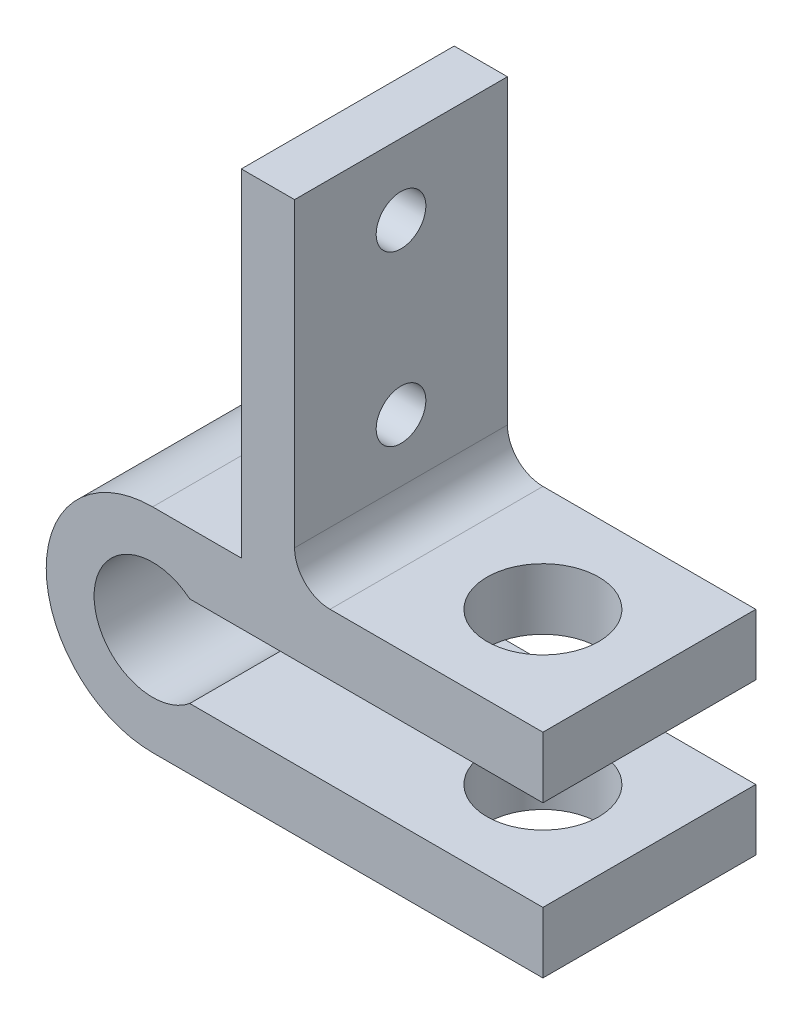
ISO-10303-21;
HEADER;
FILE_DESCRIPTION(('STEP AP214'),'2;1');
FILE_NAME('part.step','',(''),(''),'','','');
FILE_SCHEMA(('AUTOMOTIVE_DESIGN { 1 0 10303 214 1 1 1 1 }'));
ENDSEC;
DATA;
#1=APPLICATION_CONTEXT('core data for automotive mechanical design processes');
#2=APPLICATION_PROTOCOL_DEFINITION('international standard','automotive_design',2000,#1);
#3=PRODUCT_CONTEXT('',#1,'mechanical');
#4=PRODUCT('Part','Part','',(#3));
#5=PRODUCT_RELATED_PRODUCT_CATEGORY('part','',(#4));
#6=PRODUCT_DEFINITION_FORMATION('','',#4);
#7=PRODUCT_DEFINITION_CONTEXT('part definition',#1,'design');
#8=PRODUCT_DEFINITION('design','',#6,#7);
#9=PRODUCT_DEFINITION_SHAPE('','',#8);
#10=(LENGTH_UNIT() NAMED_UNIT(*) SI_UNIT(.MILLI.,.METRE.));
#11=(NAMED_UNIT(*) PLANE_ANGLE_UNIT() SI_UNIT($,.RADIAN.));
#12=(NAMED_UNIT(*) SI_UNIT($,.STERADIAN.) SOLID_ANGLE_UNIT());
#13=UNCERTAINTY_MEASURE_WITH_UNIT(LENGTH_MEASURE(1.E-05),#10,'distance_accuracy_value','');
#14=(GEOMETRIC_REPRESENTATION_CONTEXT(3) GLOBAL_UNCERTAINTY_ASSIGNED_CONTEXT((#13)) GLOBAL_UNIT_ASSIGNED_CONTEXT((#10,
#11,#12)) REPRESENTATION_CONTEXT('',''));
#15=CARTESIAN_POINT('',(0.,0.,0.));
#16=DIRECTION('',(0.,0.,1.));
#17=DIRECTION('',(1.,0.,0.));
#18=AXIS2_PLACEMENT_3D('',#15,#16,#17);
#19=CARTESIAN_POINT('',(0.,0.,12.));
#20=DIRECTION('',(0.,0.,-1.));
#21=DIRECTION('',(-1.,0.,0.));
#22=AXIS2_PLACEMENT_3D('',#19,#20,#21);
#23=CYLINDRICAL_SURFACE('',#22,3.3);
#24=CARTESIAN_POINT('',(0.,0.,0.));
#25=DIRECTION('',(0.,0.,-1.));
#26=DIRECTION('',(1.,0.,0.));
#27=AXIS2_PLACEMENT_3D('',#24,#25,#26);
#28=CIRCLE('',#27,3.3);
#29=CARTESIAN_POINT('',(2.09133180710731,-2.55271057360235,0.));
#30=VERTEX_POINT('',#29);
#31=CARTESIAN_POINT('',(2.09133180710731,2.55271057360235,0.));
#32=VERTEX_POINT('',#31);
#33=EDGE_CURVE('E160',#30,#32,#28,.T.);
#34=ORIENTED_EDGE('',*,*,#33,.T.);
#35=DIRECTION('',(0.,0.,-1.));
#36=VECTOR('',#35,1.);
#37=CARTESIAN_POINT('',(2.09133180710731,2.55271057360235,12.));
#38=LINE('',#37,#36);
#39=CARTESIAN_POINT('',(2.09133180710731,2.55271057360235,12.));
#40=VERTEX_POINT('',#39);
#41=EDGE_CURVE('E12',#40,#32,#38,.T.);
#42=ORIENTED_EDGE('',*,*,#41,.F.);
#43=CARTESIAN_POINT('',(0.,0.,12.));
#44=DIRECTION('',(0.,0.,-1.));
#45=DIRECTION('',(1.,0.,0.));
#46=AXIS2_PLACEMENT_3D('',#43,#44,#45);
#47=CIRCLE('',#46,3.3);
#48=CARTESIAN_POINT('',(2.09133180710731,-2.55271057360235,12.));
#49=VERTEX_POINT('',#48);
#50=EDGE_CURVE('E185',#49,#40,#47,.T.);
#51=ORIENTED_EDGE('',*,*,#50,.F.);
#52=DIRECTION('',(0.,0.,-1.));
#53=VECTOR('',#52,1.);
#54=CARTESIAN_POINT('',(2.09133180710731,-2.55271057360235,12.));
#55=LINE('',#54,#53);
#56=EDGE_CURVE('E156',#49,#30,#55,.T.);
#57=ORIENTED_EDGE('',*,*,#56,.T.);
#58=EDGE_LOOP('',(#34,#42,#51,#57));
#59=FACE_BOUND('',#58,.T.);
#60=ADVANCED_FACE('F33',(#59),#23,.F.);
#61=CARTESIAN_POINT('',(22.,2.55271057360236,12.));
#62=DIRECTION('',(0.,1.,0.));
#63=DIRECTION('',(-1.,0.,0.));
#64=AXIS2_PLACEMENT_3D('',#61,#62,#63);
#65=PLANE('',#64);
#66=CARTESIAN_POINT('',(16.,2.55271057360236,6.));
#67=DIRECTION('',(0.,1.,0.));
#68=DIRECTION('',(-1.,0.,0.));
#69=AXIS2_PLACEMENT_3D('',#66,#67,#68);
#70=CIRCLE('',#69,3.15);
#71=CARTESIAN_POINT('',(12.85,2.55271057360236,6.));
#72=VERTEX_POINT('',#71);
#73=EDGE_CURVE('E164',#72,#72,#70,.T.);
#74=ORIENTED_EDGE('',*,*,#73,.T.);
#75=EDGE_LOOP('',(#74));
#76=FACE_BOUND('',#75,.T.);
#77=DIRECTION('',(1.,0.,0.));
#78=VECTOR('',#77,1.);
#79=CARTESIAN_POINT('',(22.,2.55271057360236,0.));
#80=LINE('',#79,#78);
#81=CARTESIAN_POINT('',(22.,2.55271057360236,0.));
#82=VERTEX_POINT('',#81);
#83=EDGE_CURVE('E163',#32,#82,#80,.T.);
#84=ORIENTED_EDGE('',*,*,#83,.T.);
#85=DIRECTION('',(0.,0.,-1.));
#86=VECTOR('',#85,1.);
#87=CARTESIAN_POINT('',(22.,2.55271057360236,12.));
#88=LINE('',#87,#86);
#89=CARTESIAN_POINT('',(22.,2.55271057360236,12.));
#90=VERTEX_POINT('',#89);
#91=EDGE_CURVE('E42',#90,#82,#88,.T.);
#92=ORIENTED_EDGE('',*,*,#91,.F.);
#93=DIRECTION('',(1.,0.,0.));
#94=VECTOR('',#93,1.);
#95=CARTESIAN_POINT('',(22.,2.55271057360236,12.));
#96=LINE('',#95,#94);
#97=EDGE_CURVE('E108',#40,#90,#96,.T.);
#98=ORIENTED_EDGE('',*,*,#97,.F.);
#99=ORIENTED_EDGE('',*,*,#41,.T.);
#100=EDGE_LOOP('',(#84,#92,#98,#99));
#101=FACE_BOUND('',#100,.T.);
#102=ADVANCED_FACE('F271',(#76,#101),#65,.F.);
#103=CARTESIAN_POINT('',(22.,6.,12.));
#104=DIRECTION('',(-1.,0.,0.));
#105=DIRECTION('',(0.,0.,1.));
#106=AXIS2_PLACEMENT_3D('',#103,#104,#105);
#107=PLANE('',#106);
#108=DIRECTION('',(0.,1.,0.));
#109=VECTOR('',#108,1.);
#110=CARTESIAN_POINT('',(22.,6.,0.));
#111=LINE('',#110,#109);
#112=CARTESIAN_POINT('',(22.,6.,0.));
#113=VERTEX_POINT('',#112);
#114=EDGE_CURVE('E166',#82,#113,#111,.T.);
#115=ORIENTED_EDGE('',*,*,#114,.T.);
#116=DIRECTION('',(0.,0.,-1.));
#117=VECTOR('',#116,1.);
#118=CARTESIAN_POINT('',(22.,6.,12.));
#119=LINE('',#118,#117);
#120=CARTESIAN_POINT('',(22.,6.,12.));
#121=VERTEX_POINT('',#120);
#122=EDGE_CURVE('E207',#121,#113,#119,.T.);
#123=ORIENTED_EDGE('',*,*,#122,.F.);
#124=DIRECTION('',(0.,1.,0.));
#125=VECTOR('',#124,1.);
#126=CARTESIAN_POINT('',(22.,6.,12.));
#127=LINE('',#126,#125);
#128=EDGE_CURVE('E216',#90,#121,#127,.T.);
#129=ORIENTED_EDGE('',*,*,#128,.F.);
#130=ORIENTED_EDGE('',*,*,#91,.T.);
#131=EDGE_LOOP('',(#115,#123,#129,#130));
#132=FACE_BOUND('',#131,.T.);
#133=ADVANCED_FACE('F214',(#132),#107,.F.);
#134=CARTESIAN_POINT('',(10.,6.,12.));
#135=DIRECTION('',(0.,-1.,0.));
#136=DIRECTION('',(1.,0.,0.));
#137=AXIS2_PLACEMENT_3D('',#134,#135,#136);
#138=PLANE('',#137);
#139=CARTESIAN_POINT('',(16.,6.,6.));
#140=DIRECTION('',(0.,-1.,0.));
#141=DIRECTION('',(1.,0.,0.));
#142=AXIS2_PLACEMENT_3D('',#139,#140,#141);
#143=CIRCLE('',#142,3.15);
#144=CARTESIAN_POINT('',(19.15,6.,6.));
#145=VERTEX_POINT('',#144);
#146=EDGE_CURVE('E313',#145,#145,#143,.T.);
#147=ORIENTED_EDGE('',*,*,#146,.T.);
#148=EDGE_LOOP('',(#147));
#149=FACE_BOUND('',#148,.T.);
#150=DIRECTION('',(-1.,0.,0.));
#151=VECTOR('',#150,1.);
#152=CARTESIAN_POINT('',(10.,6.,0.));
#153=LINE('',#152,#151);
#154=CARTESIAN_POINT('',(10.,6.,0.));
#155=VERTEX_POINT('',#154);
#156=EDGE_CURVE('E168',#113,#155,#153,.T.);
#157=ORIENTED_EDGE('',*,*,#156,.T.);
#158=DIRECTION('',(0.,0.,-1.));
#159=VECTOR('',#158,1.);
#160=CARTESIAN_POINT('',(10.,6.,12.));
#161=LINE('',#160,#159);
#162=CARTESIAN_POINT('',(10.,6.,12.));
#163=VERTEX_POINT('',#162);
#164=EDGE_CURVE('E204',#163,#155,#161,.T.);
#165=ORIENTED_EDGE('',*,*,#164,.F.);
#166=DIRECTION('',(-1.,0.,0.));
#167=VECTOR('',#166,1.);
#168=CARTESIAN_POINT('',(10.,6.,12.));
#169=LINE('',#168,#167);
#170=EDGE_CURVE('E234',#121,#163,#169,.T.);
#171=ORIENTED_EDGE('',*,*,#170,.F.);
#172=ORIENTED_EDGE('',*,*,#122,.T.);
#173=EDGE_LOOP('',(#157,#165,#171,#172));
#174=FACE_BOUND('',#173,.T.);
#175=ADVANCED_FACE('F225',(#149,#174),#138,.F.);
#176=CARTESIAN_POINT('',(10.,8.,12.));
#177=DIRECTION('',(0.,0.,-1.));
#178=DIRECTION('',(-1.,0.,0.));
#179=AXIS2_PLACEMENT_3D('',#176,#177,#178);
#180=CYLINDRICAL_SURFACE('',#179,2.);
#181=CARTESIAN_POINT('',(10.,8.,0.));
#182=DIRECTION('',(0.,0.,-1.));
#183=DIRECTION('',(1.,0.,0.));
#184=AXIS2_PLACEMENT_3D('',#181,#182,#183);
#185=CIRCLE('',#184,2.);
#186=CARTESIAN_POINT('',(8.,8.,0.));
#187=VERTEX_POINT('',#186);
#188=EDGE_CURVE('E170',#155,#187,#185,.T.);
#189=ORIENTED_EDGE('',*,*,#188,.T.);
#190=DIRECTION('',(0.,0.,-1.));
#191=VECTOR('',#190,1.);
#192=CARTESIAN_POINT('',(8.,8.,12.));
#193=LINE('',#192,#191);
#194=CARTESIAN_POINT('',(8.,8.,12.));
#195=VERTEX_POINT('',#194);
#196=EDGE_CURVE('E201',#195,#187,#193,.T.);
#197=ORIENTED_EDGE('',*,*,#196,.F.);
#198=CARTESIAN_POINT('',(10.,8.,12.));
#199=DIRECTION('',(0.,0.,-1.));
#200=DIRECTION('',(1.,0.,0.));
#201=AXIS2_PLACEMENT_3D('',#198,#199,#200);
#202=CIRCLE('',#201,2.);
#203=EDGE_CURVE('E231',#163,#195,#202,.T.);
#204=ORIENTED_EDGE('',*,*,#203,.F.);
#205=ORIENTED_EDGE('',*,*,#164,.T.);
#206=EDGE_LOOP('',(#189,#197,#204,#205));
#207=FACE_BOUND('',#206,.T.);
#208=ADVANCED_FACE('F229',(#207),#180,.F.);
#209=CARTESIAN_POINT('',(8.,25.,12.));
#210=DIRECTION('',(-1.,0.,0.));
#211=DIRECTION('',(0.,0.,1.));
#212=AXIS2_PLACEMENT_3D('',#209,#210,#211);
#213=PLANE('',#212);
#214=CARTESIAN_POINT('',(8.,11.5,6.));
#215=DIRECTION('',(-1.,0.,0.));
#216=DIRECTION('',(0.,0.,1.));
#217=AXIS2_PLACEMENT_3D('',#214,#215,#216);
#218=CIRCLE('',#217,1.4);
#219=CARTESIAN_POINT('',(8.,11.5,7.4));
#220=VERTEX_POINT('',#219);
#221=EDGE_CURVE('E394',#220,#220,#218,.F.);
#222=ORIENTED_EDGE('',*,*,#221,.F.);
#223=EDGE_LOOP('',(#222));
#224=FACE_BOUND('',#223,.T.);
#225=CARTESIAN_POINT('',(8.,21.,6.));
#226=DIRECTION('',(-1.,0.,0.));
#227=DIRECTION('',(0.,0.,1.));
#228=AXIS2_PLACEMENT_3D('',#225,#226,#227);
#229=CIRCLE('',#228,1.4);
#230=CARTESIAN_POINT('',(8.,21.,7.4));
#231=VERTEX_POINT('',#230);
#232=EDGE_CURVE('E311',#231,#231,#229,.F.);
#233=ORIENTED_EDGE('',*,*,#232,.F.);
#234=EDGE_LOOP('',(#233));
#235=FACE_BOUND('',#234,.T.);
#236=DIRECTION('',(0.,1.,0.));
#237=VECTOR('',#236,1.);
#238=CARTESIAN_POINT('',(8.,25.,0.));
#239=LINE('',#238,#237);
#240=CARTESIAN_POINT('',(8.,25.,0.));
#241=VERTEX_POINT('',#240);
#242=EDGE_CURVE('E172',#187,#241,#239,.T.);
#243=ORIENTED_EDGE('',*,*,#242,.T.);
#244=DIRECTION('',(0.,0.,-1.));
#245=VECTOR('',#244,1.);
#246=CARTESIAN_POINT('',(8.,25.,12.));
#247=LINE('',#246,#245);
#248=CARTESIAN_POINT('',(8.,25.,12.));
#249=VERTEX_POINT('',#248);
#250=EDGE_CURVE('E198',#249,#241,#247,.T.);
#251=ORIENTED_EDGE('',*,*,#250,.F.);
#252=DIRECTION('',(0.,1.,0.));
#253=VECTOR('',#252,1.);
#254=CARTESIAN_POINT('',(8.,25.,12.));
#255=LINE('',#254,#253);
#256=EDGE_CURVE('E233',#195,#249,#255,.T.);
#257=ORIENTED_EDGE('',*,*,#256,.F.);
#258=ORIENTED_EDGE('',*,*,#196,.T.);
#259=EDGE_LOOP('',(#243,#251,#257,#258));
#260=FACE_BOUND('',#259,.T.);
#261=ADVANCED_FACE('F287',(#224,#235,#260),#213,.F.);
#262=CARTESIAN_POINT('',(5.,25.,12.));
#263=DIRECTION('',(0.,-1.,0.));
#264=DIRECTION('',(0.,0.,-1.));
#265=AXIS2_PLACEMENT_3D('',#262,#263,#264);
#266=PLANE('',#265);
#267=DIRECTION('',(-1.,0.,0.));
#268=VECTOR('',#267,1.);
#269=CARTESIAN_POINT('',(5.,25.,0.));
#270=LINE('',#269,#268);
#271=CARTESIAN_POINT('',(5.,25.,0.));
#272=VERTEX_POINT('',#271);
#273=EDGE_CURVE('E174',#241,#272,#270,.T.);
#274=ORIENTED_EDGE('',*,*,#273,.T.);
#275=DIRECTION('',(0.,0.,-1.));
#276=VECTOR('',#275,1.);
#277=CARTESIAN_POINT('',(5.,25.,12.));
#278=LINE('',#277,#276);
#279=CARTESIAN_POINT('',(5.,25.,12.));
#280=VERTEX_POINT('',#279);
#281=EDGE_CURVE('E195',#280,#272,#278,.T.);
#282=ORIENTED_EDGE('',*,*,#281,.F.);
#283=DIRECTION('',(-1.,0.,0.));
#284=VECTOR('',#283,1.);
#285=CARTESIAN_POINT('',(5.,25.,12.));
#286=LINE('',#285,#284);
#287=EDGE_CURVE('E236',#249,#280,#286,.T.);
#288=ORIENTED_EDGE('',*,*,#287,.F.);
#289=ORIENTED_EDGE('',*,*,#250,.T.);
#290=EDGE_LOOP('',(#274,#282,#288,#289));
#291=FACE_BOUND('',#290,.T.);
#292=ADVANCED_FACE('F290',(#291),#266,.F.);
#293=CARTESIAN_POINT('',(5.,6.,12.));
#294=DIRECTION('',(1.,0.,0.));
#295=DIRECTION('',(0.,0.,-1.));
#296=AXIS2_PLACEMENT_3D('',#293,#294,#295);
#297=PLANE('',#296);
#298=CARTESIAN_POINT('',(5.,11.5,6.));
#299=DIRECTION('',(-1.,0.,0.));
#300=DIRECTION('',(0.,0.,1.));
#301=AXIS2_PLACEMENT_3D('',#298,#299,#300);
#302=CIRCLE('',#301,1.4);
#303=CARTESIAN_POINT('',(5.,11.5,7.4));
#304=VERTEX_POINT('',#303);
#305=EDGE_CURVE('E391',#304,#304,#302,.T.);
#306=ORIENTED_EDGE('',*,*,#305,.F.);
#307=EDGE_LOOP('',(#306));
#308=FACE_BOUND('',#307,.T.);
#309=CARTESIAN_POINT('',(5.,21.,6.));
#310=DIRECTION('',(-1.,0.,0.));
#311=DIRECTION('',(0.,0.,1.));
#312=AXIS2_PLACEMENT_3D('',#309,#310,#311);
#313=CIRCLE('',#312,1.4);
#314=CARTESIAN_POINT('',(5.,21.,7.4));
#315=VERTEX_POINT('',#314);
#316=EDGE_CURVE('E315',#315,#315,#313,.T.);
#317=ORIENTED_EDGE('',*,*,#316,.F.);
#318=EDGE_LOOP('',(#317));
#319=FACE_BOUND('',#318,.T.);
#320=DIRECTION('',(0.,-1.,0.));
#321=VECTOR('',#320,1.);
#322=CARTESIAN_POINT('',(5.,6.,0.));
#323=LINE('',#322,#321);
#324=CARTESIAN_POINT('',(5.,6.,0.));
#325=VERTEX_POINT('',#324);
#326=EDGE_CURVE('E176',#272,#325,#323,.T.);
#327=ORIENTED_EDGE('',*,*,#326,.T.);
#328=DIRECTION('',(0.,0.,-1.));
#329=VECTOR('',#328,1.);
#330=CARTESIAN_POINT('',(5.,6.,12.));
#331=LINE('',#330,#329);
#332=CARTESIAN_POINT('',(5.,6.,12.));
#333=VERTEX_POINT('',#332);
#334=EDGE_CURVE('E192',#333,#325,#331,.T.);
#335=ORIENTED_EDGE('',*,*,#334,.F.);
#336=DIRECTION('',(0.,-1.,0.));
#337=VECTOR('',#336,1.);
#338=CARTESIAN_POINT('',(5.,6.,12.));
#339=LINE('',#338,#337);
#340=EDGE_CURVE('E242',#280,#333,#339,.T.);
#341=ORIENTED_EDGE('',*,*,#340,.F.);
#342=ORIENTED_EDGE('',*,*,#281,.T.);
#343=EDGE_LOOP('',(#327,#335,#341,#342));
#344=FACE_BOUND('',#343,.T.);
#345=ADVANCED_FACE('F294',(#308,#319,#344),#297,.F.);
#346=CARTESIAN_POINT('',(0.,6.,12.));
#347=DIRECTION('',(0.,-1.,0.));
#348=DIRECTION('',(0.,0.,-1.));
#349=AXIS2_PLACEMENT_3D('',#346,#347,#348);
#350=PLANE('',#349);
#351=DIRECTION('',(-1.,0.,0.));
#352=VECTOR('',#351,1.);
#353=CARTESIAN_POINT('',(0.,6.,0.));
#354=LINE('',#353,#352);
#355=CARTESIAN_POINT('',(0.,6.,0.));
#356=VERTEX_POINT('',#355);
#357=EDGE_CURVE('E178',#325,#356,#354,.T.);
#358=ORIENTED_EDGE('',*,*,#357,.T.);
#359=DIRECTION('',(0.,0.,-1.));
#360=VECTOR('',#359,1.);
#361=CARTESIAN_POINT('',(0.,6.,12.));
#362=LINE('',#361,#360);
#363=CARTESIAN_POINT('',(0.,6.,12.));
#364=VERTEX_POINT('',#363);
#365=EDGE_CURVE('E189',#364,#356,#362,.T.);
#366=ORIENTED_EDGE('',*,*,#365,.F.);
#367=DIRECTION('',(-1.,0.,0.));
#368=VECTOR('',#367,1.);
#369=CARTESIAN_POINT('',(0.,6.,12.));
#370=LINE('',#369,#368);
#371=EDGE_CURVE('E244',#333,#364,#370,.T.);
#372=ORIENTED_EDGE('',*,*,#371,.F.);
#373=ORIENTED_EDGE('',*,*,#334,.T.);
#374=EDGE_LOOP('',(#358,#366,#372,#373));
#375=FACE_BOUND('',#374,.T.);
#376=ADVANCED_FACE('F250',(#375),#350,.F.);
#377=CARTESIAN_POINT('',(0.,0.,12.));
#378=DIRECTION('',(0.,0.,-1.));
#379=DIRECTION('',(-1.,0.,0.));
#380=AXIS2_PLACEMENT_3D('',#377,#378,#379);
#381=CYLINDRICAL_SURFACE('',#380,6.);
#382=CARTESIAN_POINT('',(0.,0.,0.));
#383=DIRECTION('',(0.,0.,1.));
#384=DIRECTION('',(1.,0.,0.));
#385=AXIS2_PLACEMENT_3D('',#382,#383,#384);
#386=CIRCLE('',#385,6.);
#387=CARTESIAN_POINT('',(0.,-6.,0.));
#388=VERTEX_POINT('',#387);
#389=EDGE_CURVE('E180',#356,#388,#386,.T.);
#390=ORIENTED_EDGE('',*,*,#389,.T.);
#391=DIRECTION('',(0.,0.,-1.));
#392=VECTOR('',#391,1.);
#393=CARTESIAN_POINT('',(0.,-6.,12.));
#394=LINE('',#393,#392);
#395=CARTESIAN_POINT('',(0.,-6.,12.));
#396=VERTEX_POINT('',#395);
#397=EDGE_CURVE('E151',#396,#388,#394,.T.);
#398=ORIENTED_EDGE('',*,*,#397,.F.);
#399=CARTESIAN_POINT('',(0.,0.,12.));
#400=DIRECTION('',(0.,0.,1.));
#401=DIRECTION('',(1.,0.,0.));
#402=AXIS2_PLACEMENT_3D('',#399,#400,#401);
#403=CIRCLE('',#402,6.);
#404=EDGE_CURVE('E142',#364,#396,#403,.T.);
#405=ORIENTED_EDGE('',*,*,#404,.F.);
#406=ORIENTED_EDGE('',*,*,#365,.T.);
#407=EDGE_LOOP('',(#390,#398,#405,#406));
#408=FACE_BOUND('',#407,.T.);
#409=ADVANCED_FACE('F254',(#408),#381,.T.);
#410=CARTESIAN_POINT('',(0.,-6.,12.));
#411=DIRECTION('',(0.,1.,0.));
#412=DIRECTION('',(0.,0.,1.));
#413=AXIS2_PLACEMENT_3D('',#410,#411,#412);
#414=PLANE('',#413);
#415=CARTESIAN_POINT('',(16.,-6.,6.));
#416=DIRECTION('',(0.,1.,0.));
#417=DIRECTION('',(0.,0.,1.));
#418=AXIS2_PLACEMENT_3D('',#415,#416,#417);
#419=CIRCLE('',#418,3.15);
#420=CARTESIAN_POINT('',(16.,-6.,9.15));
#421=VERTEX_POINT('',#420);
#422=EDGE_CURVE('E309',#421,#421,#419,.T.);
#423=ORIENTED_EDGE('',*,*,#422,.T.);
#424=EDGE_LOOP('',(#423));
#425=FACE_BOUND('',#424,.T.);
#426=DIRECTION('',(1.,0.,0.));
#427=VECTOR('',#426,1.);
#428=CARTESIAN_POINT('',(0.,-6.,0.));
#429=LINE('',#428,#427);
#430=CARTESIAN_POINT('',(22.,-6.,0.));
#431=VERTEX_POINT('',#430);
#432=EDGE_CURVE('E150',#388,#431,#429,.T.);
#433=ORIENTED_EDGE('',*,*,#432,.T.);
#434=DIRECTION('',(0.,0.,-1.));
#435=VECTOR('',#434,1.);
#436=CARTESIAN_POINT('',(22.,-6.,12.));
#437=LINE('',#436,#435);
#438=CARTESIAN_POINT('',(22.,-6.,12.));
#439=VERTEX_POINT('',#438);
#440=EDGE_CURVE('E147',#439,#431,#437,.T.);
#441=ORIENTED_EDGE('',*,*,#440,.F.);
#442=DIRECTION('',(1.,0.,0.));
#443=VECTOR('',#442,1.);
#444=CARTESIAN_POINT('',(0.,-6.,12.));
#445=LINE('',#444,#443);
#446=EDGE_CURVE('E136',#396,#439,#445,.T.);
#447=ORIENTED_EDGE('',*,*,#446,.F.);
#448=ORIENTED_EDGE('',*,*,#397,.T.);
#449=EDGE_LOOP('',(#433,#441,#447,#448));
#450=FACE_BOUND('',#449,.T.);
#451=ADVANCED_FACE('F148',(#425,#450),#414,.F.);
#452=CARTESIAN_POINT('',(22.,-6.,12.));
#453=DIRECTION('',(-1.,0.,0.));
#454=DIRECTION('',(0.,0.,1.));
#455=AXIS2_PLACEMENT_3D('',#452,#453,#454);
#456=PLANE('',#455);
#457=DIRECTION('',(0.,1.,0.));
#458=VECTOR('',#457,1.);
#459=CARTESIAN_POINT('',(22.,-6.,0.));
#460=LINE('',#459,#458);
#461=CARTESIAN_POINT('',(22.,-2.55271057360236,0.));
#462=VERTEX_POINT('',#461);
#463=EDGE_CURVE('E94',#431,#462,#460,.T.);
#464=ORIENTED_EDGE('',*,*,#463,.T.);
#465=DIRECTION('',(0.,0.,-1.));
#466=VECTOR('',#465,1.);
#467=CARTESIAN_POINT('',(22.,-2.55271057360236,12.));
#468=LINE('',#467,#466);
#469=CARTESIAN_POINT('',(22.,-2.55271057360236,12.));
#470=VERTEX_POINT('',#469);
#471=EDGE_CURVE('E152',#470,#462,#468,.T.);
#472=ORIENTED_EDGE('',*,*,#471,.F.);
#473=DIRECTION('',(0.,1.,0.));
#474=VECTOR('',#473,1.);
#475=CARTESIAN_POINT('',(22.,-6.,12.));
#476=LINE('',#475,#474);
#477=EDGE_CURVE('E140',#439,#470,#476,.T.);
#478=ORIENTED_EDGE('',*,*,#477,.F.);
#479=ORIENTED_EDGE('',*,*,#440,.T.);
#480=EDGE_LOOP('',(#464,#472,#478,#479));
#481=FACE_BOUND('',#480,.T.);
#482=ADVANCED_FACE('F154',(#481),#456,.F.);
#483=CARTESIAN_POINT('',(22.,-2.55271057360236,12.));
#484=DIRECTION('',(0.,-1.,0.));
#485=DIRECTION('',(1.,0.,0.));
#486=AXIS2_PLACEMENT_3D('',#483,#484,#485);
#487=PLANE('',#486);
#488=CARTESIAN_POINT('',(16.,-2.55271057360236,6.));
#489=DIRECTION('',(0.,-1.,0.));
#490=DIRECTION('',(1.,0.,0.));
#491=AXIS2_PLACEMENT_3D('',#488,#489,#490);
#492=CIRCLE('',#491,3.15);
#493=CARTESIAN_POINT('',(19.15,-2.55271057360236,6.));
#494=VERTEX_POINT('',#493);
#495=EDGE_CURVE('E36',#494,#494,#492,.T.);
#496=ORIENTED_EDGE('',*,*,#495,.T.);
#497=EDGE_LOOP('',(#496));
#498=FACE_BOUND('',#497,.T.);
#499=DIRECTION('',(-1.,0.,0.));
#500=VECTOR('',#499,1.);
#501=CARTESIAN_POINT('',(22.,-2.55271057360236,0.));
#502=LINE('',#501,#500);
#503=EDGE_CURVE('E100',#462,#30,#502,.T.);
#504=ORIENTED_EDGE('',*,*,#503,.T.);
#505=ORIENTED_EDGE('',*,*,#56,.F.);
#506=DIRECTION('',(-1.,0.,0.));
#507=VECTOR('',#506,1.);
#508=CARTESIAN_POINT('',(22.,-2.55271057360236,12.));
#509=LINE('',#508,#507);
#510=EDGE_CURVE('E50',#470,#49,#509,.T.);
#511=ORIENTED_EDGE('',*,*,#510,.F.);
#512=ORIENTED_EDGE('',*,*,#471,.T.);
#513=EDGE_LOOP('',(#504,#505,#511,#512));
#514=FACE_BOUND('',#513,.T.);
#515=ADVANCED_FACE('F258',(#498,#514),#487,.F.);
#516=CARTESIAN_POINT('',(0.,0.,12.));
#517=DIRECTION('',(0.,0.,1.));
#518=DIRECTION('',(1.,0.,0.));
#519=AXIS2_PLACEMENT_3D('',#516,#517,#518);
#520=PLANE('',#519);
#521=ORIENTED_EDGE('',*,*,#50,.T.);
#522=ORIENTED_EDGE('',*,*,#97,.T.);
#523=ORIENTED_EDGE('',*,*,#128,.T.);
#524=ORIENTED_EDGE('',*,*,#170,.T.);
#525=ORIENTED_EDGE('',*,*,#203,.T.);
#526=ORIENTED_EDGE('',*,*,#256,.T.);
#527=ORIENTED_EDGE('',*,*,#287,.T.);
#528=ORIENTED_EDGE('',*,*,#340,.T.);
#529=ORIENTED_EDGE('',*,*,#371,.T.);
#530=ORIENTED_EDGE('',*,*,#404,.T.);
#531=ORIENTED_EDGE('',*,*,#446,.T.);
#532=ORIENTED_EDGE('',*,*,#477,.T.);
#533=ORIENTED_EDGE('',*,*,#510,.T.);
#534=EDGE_LOOP('',(#521,#522,#523,#524,#525,#526,#527,#528,#529,#530,#531,#532,#533));
#535=FACE_BOUND('',#534,.T.);
#536=ADVANCED_FACE('F138',(#535),#520,.T.);
#537=CARTESIAN_POINT('',(0.,0.,0.));
#538=DIRECTION('',(0.,0.,1.));
#539=DIRECTION('',(1.,0.,0.));
#540=AXIS2_PLACEMENT_3D('',#537,#538,#539);
#541=PLANE('',#540);
#542=ORIENTED_EDGE('',*,*,#33,.F.);
#543=ORIENTED_EDGE('',*,*,#503,.F.);
#544=ORIENTED_EDGE('',*,*,#463,.F.);
#545=ORIENTED_EDGE('',*,*,#432,.F.);
#546=ORIENTED_EDGE('',*,*,#389,.F.);
#547=ORIENTED_EDGE('',*,*,#357,.F.);
#548=ORIENTED_EDGE('',*,*,#326,.F.);
#549=ORIENTED_EDGE('',*,*,#273,.F.);
#550=ORIENTED_EDGE('',*,*,#242,.F.);
#551=ORIENTED_EDGE('',*,*,#188,.F.);
#552=ORIENTED_EDGE('',*,*,#156,.F.);
#553=ORIENTED_EDGE('',*,*,#114,.F.);
#554=ORIENTED_EDGE('',*,*,#83,.F.);
#555=EDGE_LOOP('',(#542,#543,#544,#545,#546,#547,#548,#549,#550,#551,#552,#553,#554));
#556=FACE_BOUND('',#555,.T.);
#557=ADVANCED_FACE('F220',(#556),#541,.F.);
#558=CARTESIAN_POINT('',(16.,-6.,6.));
#559=DIRECTION('',(0.,1.,0.));
#560=DIRECTION('',(0.,0.,1.));
#561=AXIS2_PLACEMENT_3D('',#558,#559,#560);
#562=CYLINDRICAL_SURFACE('',#561,3.15);
#563=ORIENTED_EDGE('',*,*,#422,.F.);
#564=EDGE_LOOP('',(#563));
#565=FACE_BOUND('',#564,.T.);
#566=ORIENTED_EDGE('',*,*,#495,.F.);
#567=EDGE_LOOP('',(#566));
#568=FACE_BOUND('',#567,.T.);
#569=ADVANCED_FACE('F328',(#565,#568),#562,.F.);
#570=ORIENTED_EDGE('',*,*,#146,.F.);
#571=EDGE_LOOP('',(#570));
#572=FACE_BOUND('',#571,.T.);
#573=ORIENTED_EDGE('',*,*,#73,.F.);
#574=EDGE_LOOP('',(#573));
#575=FACE_BOUND('',#574,.T.);
#576=ADVANCED_FACE('F325',(#572,#575),#562,.F.);
#577=CARTESIAN_POINT('',(22.001,21.,6.));
#578=DIRECTION('',(-1.,0.,0.));
#579=DIRECTION('',(0.,0.,1.));
#580=AXIS2_PLACEMENT_3D('',#577,#578,#579);
#581=CYLINDRICAL_SURFACE('',#580,1.4);
#582=ORIENTED_EDGE('',*,*,#316,.T.);
#583=EDGE_LOOP('',(#582));
#584=FACE_BOUND('',#583,.T.);
#585=ORIENTED_EDGE('',*,*,#232,.T.);
#586=EDGE_LOOP('',(#585));
#587=FACE_BOUND('',#586,.T.);
#588=ADVANCED_FACE('F327',(#584,#587),#581,.F.);
#589=CARTESIAN_POINT('',(22.001,11.5,6.));
#590=DIRECTION('',(-1.,0.,0.));
#591=DIRECTION('',(0.,0.,1.));
#592=AXIS2_PLACEMENT_3D('',#589,#590,#591);
#593=CYLINDRICAL_SURFACE('',#592,1.4);
#594=ORIENTED_EDGE('',*,*,#305,.T.);
#595=EDGE_LOOP('',(#594));
#596=FACE_BOUND('',#595,.T.);
#597=ORIENTED_EDGE('',*,*,#221,.T.);
#598=EDGE_LOOP('',(#597));
#599=FACE_BOUND('',#598,.T.);
#600=ADVANCED_FACE('F335',(#596,#599),#593,.F.);
#601=CLOSED_SHELL('',(#60,#102,#133,#175,#208,#261,#292,#345,#376,#409,#451,#482,#515,#536,#557,
#569,#576,#588,#600));
#602=MANIFOLD_SOLID_BREP('B2',#601);
#603=ADVANCED_BREP_SHAPE_REPRESENTATION('',(#18,#602),#14);
#604=SHAPE_DEFINITION_REPRESENTATION(#9,#603);
ENDSEC;
END-ISO-10303-21;
